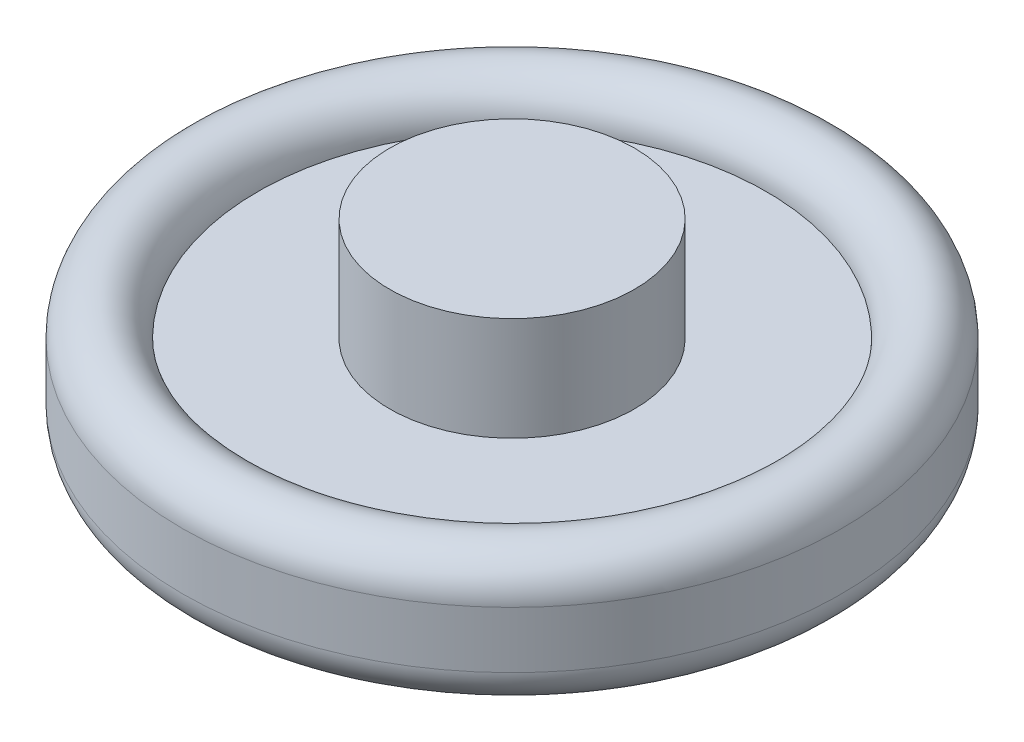
ISO-10303-21;
HEADER;
FILE_DESCRIPTION(('STEP AP214'),'2;1');
FILE_NAME('part.step','',(''),(''),'','','');
FILE_SCHEMA(('AUTOMOTIVE_DESIGN { 1 0 10303 214 1 1 1 1 }'));
ENDSEC;
DATA;
#1=APPLICATION_CONTEXT('core data for automotive mechanical design processes');
#2=APPLICATION_PROTOCOL_DEFINITION('international standard','automotive_design',2000,#1);
#3=PRODUCT_CONTEXT('',#1,'mechanical');
#4=PRODUCT('Part','Part','',(#3));
#5=PRODUCT_RELATED_PRODUCT_CATEGORY('part','',(#4));
#6=PRODUCT_DEFINITION_FORMATION('','',#4);
#7=PRODUCT_DEFINITION_CONTEXT('part definition',#1,'design');
#8=PRODUCT_DEFINITION('design','',#6,#7);
#9=PRODUCT_DEFINITION_SHAPE('','',#8);
#10=(LENGTH_UNIT() NAMED_UNIT(*) SI_UNIT(.MILLI.,.METRE.));
#11=(NAMED_UNIT(*) PLANE_ANGLE_UNIT() SI_UNIT($,.RADIAN.));
#12=(NAMED_UNIT(*) SI_UNIT($,.STERADIAN.) SOLID_ANGLE_UNIT());
#13=UNCERTAINTY_MEASURE_WITH_UNIT(LENGTH_MEASURE(1.E-05),#10,'distance_accuracy_value','');
#14=(GEOMETRIC_REPRESENTATION_CONTEXT(3) GLOBAL_UNCERTAINTY_ASSIGNED_CONTEXT((#13)) GLOBAL_UNIT_ASSIGNED_CONTEXT((#10,
#11,#12)) REPRESENTATION_CONTEXT('',''));
#15=CARTESIAN_POINT('',(0.,0.,0.));
#16=DIRECTION('',(0.,0.,1.));
#17=DIRECTION('',(1.,0.,0.));
#18=AXIS2_PLACEMENT_3D('',#15,#16,#17);
#19=CARTESIAN_POINT('',(-4.61880215351701,-0.249999999999999,0.));
#20=DIRECTION('',(0.866025403784439,0.,0.499999999999999));
#21=DIRECTION('',(0.5,0.,-0.866025403784438));
#22=AXIS2_PLACEMENT_3D('',#19,#20,#21);
#23=PLANE('',#22);
#24=DIRECTION('',(0.5,0.,-0.866025403784438));
#25=VECTOR('',#24,1.);
#26=CARTESIAN_POINT('',(-4.61880215351701,1.25,0.));
#27=LINE('',#26,#25);
#28=CARTESIAN_POINT('',(-4.61880215351701,1.25,0.));
#29=VERTEX_POINT('',#28);
#30=CARTESIAN_POINT('',(-2.3094010767585,1.25,-4.));
#31=VERTEX_POINT('',#30);
#32=EDGE_CURVE('E260',#29,#31,#27,.T.);
#33=ORIENTED_EDGE('',*,*,#32,.F.);
#34=DIRECTION('',(0.,0.999999999999998,0.));
#35=VECTOR('',#34,1.);
#36=CARTESIAN_POINT('',(-4.61880215351701,-0.249999999999999,0.));
#37=LINE('',#36,#35);
#38=CARTESIAN_POINT('',(-4.61880215351701,-0.249999999999999,0.));
#39=VERTEX_POINT('',#38);
#40=EDGE_CURVE('E240',#39,#29,#37,.T.);
#41=ORIENTED_EDGE('',*,*,#40,.F.);
#42=DIRECTION('',(0.5,0.,-0.866025403784438));
#43=VECTOR('',#42,1.);
#44=CARTESIAN_POINT('',(-4.61880215351701,-0.249999999999999,0.));
#45=LINE('',#44,#43);
#46=CARTESIAN_POINT('',(-2.3094010767585,-0.249999999999999,-4.));
#47=VERTEX_POINT('',#46);
#48=EDGE_CURVE('E247',#39,#47,#45,.T.);
#49=ORIENTED_EDGE('',*,*,#48,.T.);
#50=DIRECTION('',(0.,0.999999999999998,0.));
#51=VECTOR('',#50,1.);
#52=CARTESIAN_POINT('',(-2.3094010767585,-0.249999999999999,-4.));
#53=LINE('',#52,#51);
#54=EDGE_CURVE('E130',#47,#31,#53,.T.);
#55=ORIENTED_EDGE('',*,*,#54,.T.);
#56=EDGE_LOOP('',(#33,#41,#49,#55));
#57=FACE_BOUND('',#56,.T.);
#58=ADVANCED_FACE('F36',(#57),#23,.T.);
#59=CARTESIAN_POINT('',(-2.3094010767585,-0.249999999999999,-4.));
#60=DIRECTION('',(0.,0.,0.999999999999999));
#61=DIRECTION('',(1.,0.,0.));
#62=AXIS2_PLACEMENT_3D('',#59,#60,#61);
#63=PLANE('',#62);
#64=DIRECTION('',(1.,0.,0.));
#65=VECTOR('',#64,1.);
#66=CARTESIAN_POINT('',(-2.3094010767585,1.25,-4.));
#67=LINE('',#66,#65);
#68=CARTESIAN_POINT('',(2.30940107675851,1.25,-4.));
#69=VERTEX_POINT('',#68);
#70=EDGE_CURVE('E257',#31,#69,#67,.T.);
#71=ORIENTED_EDGE('',*,*,#70,.F.);
#72=ORIENTED_EDGE('',*,*,#54,.F.);
#73=DIRECTION('',(1.,0.,0.));
#74=VECTOR('',#73,1.);
#75=CARTESIAN_POINT('',(-2.3094010767585,-0.249999999999999,-4.));
#76=LINE('',#75,#74);
#77=CARTESIAN_POINT('',(2.30940107675851,-0.249999999999999,-3.99999999999999));
#78=VERTEX_POINT('',#77);
#79=EDGE_CURVE('E275',#47,#78,#76,.T.);
#80=ORIENTED_EDGE('',*,*,#79,.T.);
#81=DIRECTION('',(0.,0.999999999999998,0.));
#82=VECTOR('',#81,1.);
#83=CARTESIAN_POINT('',(2.30940107675851,-0.249999999999999,-3.99999999999999));
#84=LINE('',#83,#82);
#85=EDGE_CURVE('E228',#78,#69,#84,.T.);
#86=ORIENTED_EDGE('',*,*,#85,.T.);
#87=EDGE_LOOP('',(#71,#72,#80,#86));
#88=FACE_BOUND('',#87,.T.);
#89=ADVANCED_FACE('F177',(#88),#63,.T.);
#90=CARTESIAN_POINT('',(2.30940107675851,-0.249999999999999,-3.99999999999999));
#91=DIRECTION('',(-0.866025403784439,0.,0.5));
#92=DIRECTION('',(0.5,0.,0.866025403784437));
#93=AXIS2_PLACEMENT_3D('',#90,#91,#92);
#94=PLANE('',#93);
#95=DIRECTION('',(0.5,0.,0.866025403784437));
#96=VECTOR('',#95,1.);
#97=CARTESIAN_POINT('',(2.30940107675851,1.25,-4.));
#98=LINE('',#97,#96);
#99=CARTESIAN_POINT('',(4.61880215351701,1.25,0.));
#100=VERTEX_POINT('',#99);
#101=EDGE_CURVE('E254',#69,#100,#98,.T.);
#102=ORIENTED_EDGE('',*,*,#101,.F.);
#103=ORIENTED_EDGE('',*,*,#85,.F.);
#104=DIRECTION('',(0.5,0.,0.866025403784437));
#105=VECTOR('',#104,1.);
#106=CARTESIAN_POINT('',(2.30940107675851,-0.249999999999999,-3.99999999999999));
#107=LINE('',#106,#105);
#108=CARTESIAN_POINT('',(4.61880215351701,-0.249999999999999,0.));
#109=VERTEX_POINT('',#108);
#110=EDGE_CURVE('E272',#78,#109,#107,.T.);
#111=ORIENTED_EDGE('',*,*,#110,.T.);
#112=DIRECTION('',(0.,0.999999999999998,0.));
#113=VECTOR('',#112,1.);
#114=CARTESIAN_POINT('',(4.61880215351701,-0.249999999999999,0.));
#115=LINE('',#114,#113);
#116=EDGE_CURVE('E231',#109,#100,#115,.T.);
#117=ORIENTED_EDGE('',*,*,#116,.T.);
#118=EDGE_LOOP('',(#102,#103,#111,#117));
#119=FACE_BOUND('',#118,.T.);
#120=ADVANCED_FACE('F183',(#119),#94,.T.);
#121=CARTESIAN_POINT('',(4.61880215351701,-0.249999999999999,0.));
#122=DIRECTION('',(-0.866025403784439,0.,-0.499999999999999));
#123=DIRECTION('',(-0.500000000000001,0.,0.866025403784438));
#124=AXIS2_PLACEMENT_3D('',#121,#122,#123);
#125=PLANE('',#124);
#126=DIRECTION('',(-0.500000000000001,0.,0.866025403784438));
#127=VECTOR('',#126,1.);
#128=CARTESIAN_POINT('',(4.61880215351701,1.25,0.));
#129=LINE('',#128,#127);
#130=CARTESIAN_POINT('',(2.3094010767585,1.25,4.));
#131=VERTEX_POINT('',#130);
#132=EDGE_CURVE('E251',#100,#131,#129,.T.);
#133=ORIENTED_EDGE('',*,*,#132,.F.);
#134=ORIENTED_EDGE('',*,*,#116,.F.);
#135=DIRECTION('',(-0.500000000000001,0.,0.866025403784438));
#136=VECTOR('',#135,1.);
#137=CARTESIAN_POINT('',(4.61880215351701,-0.249999999999999,0.));
#138=LINE('',#137,#136);
#139=CARTESIAN_POINT('',(2.3094010767585,-0.249999999999999,4.));
#140=VERTEX_POINT('',#139);
#141=EDGE_CURVE('E269',#109,#140,#138,.T.);
#142=ORIENTED_EDGE('',*,*,#141,.T.);
#143=DIRECTION('',(0.,0.999999999999998,0.));
#144=VECTOR('',#143,1.);
#145=CARTESIAN_POINT('',(2.3094010767585,-0.249999999999999,4.));
#146=LINE('',#145,#144);
#147=EDGE_CURVE('E234',#140,#131,#146,.T.);
#148=ORIENTED_EDGE('',*,*,#147,.T.);
#149=EDGE_LOOP('',(#133,#134,#142,#148));
#150=FACE_BOUND('',#149,.T.);
#151=ADVANCED_FACE('F337',(#150),#125,.T.);
#152=CARTESIAN_POINT('',(2.3094010767585,-0.249999999999999,4.));
#153=DIRECTION('',(0.,0.,-0.999999999999999));
#154=DIRECTION('',(-1.,0.,0.));
#155=AXIS2_PLACEMENT_3D('',#152,#153,#154);
#156=PLANE('',#155);
#157=DIRECTION('',(-1.,0.,0.));
#158=VECTOR('',#157,1.);
#159=CARTESIAN_POINT('',(2.3094010767585,1.25,4.));
#160=LINE('',#159,#158);
#161=CARTESIAN_POINT('',(-2.3094010767585,1.25,4.));
#162=VERTEX_POINT('',#161);
#163=EDGE_CURVE('E248',#131,#162,#160,.T.);
#164=ORIENTED_EDGE('',*,*,#163,.F.);
#165=ORIENTED_EDGE('',*,*,#147,.F.);
#166=DIRECTION('',(-1.,0.,0.));
#167=VECTOR('',#166,1.);
#168=CARTESIAN_POINT('',(2.3094010767585,-0.249999999999999,4.));
#169=LINE('',#168,#167);
#170=CARTESIAN_POINT('',(-2.3094010767585,-0.249999999999999,4.));
#171=VERTEX_POINT('',#170);
#172=EDGE_CURVE('E266',#140,#171,#169,.T.);
#173=ORIENTED_EDGE('',*,*,#172,.T.);
#174=DIRECTION('',(0.,0.999999999999998,0.));
#175=VECTOR('',#174,1.);
#176=CARTESIAN_POINT('',(-2.3094010767585,-0.249999999999999,4.));
#177=LINE('',#176,#175);
#178=EDGE_CURVE('E237',#171,#162,#177,.T.);
#179=ORIENTED_EDGE('',*,*,#178,.T.);
#180=EDGE_LOOP('',(#164,#165,#173,#179));
#181=FACE_BOUND('',#180,.T.);
#182=ADVANCED_FACE('F339',(#181),#156,.T.);
#183=CARTESIAN_POINT('',(-2.3094010767585,-0.249999999999999,4.));
#184=DIRECTION('',(0.866025403784439,0.,-0.5));
#185=DIRECTION('',(-0.5,0.,-0.866025403784437));
#186=AXIS2_PLACEMENT_3D('',#183,#184,#185);
#187=PLANE('',#186);
#188=DIRECTION('',(-0.5,0.,-0.866025403784437));
#189=VECTOR('',#188,1.);
#190=CARTESIAN_POINT('',(-2.3094010767585,1.25,4.));
#191=LINE('',#190,#189);
#192=EDGE_CURVE('E244',#162,#29,#191,.T.);
#193=ORIENTED_EDGE('',*,*,#192,.F.);
#194=ORIENTED_EDGE('',*,*,#178,.F.);
#195=DIRECTION('',(-0.5,0.,-0.866025403784437));
#196=VECTOR('',#195,1.);
#197=CARTESIAN_POINT('',(-2.3094010767585,-0.249999999999999,4.));
#198=LINE('',#197,#196);
#199=EDGE_CURVE('E243',#171,#39,#198,.T.);
#200=ORIENTED_EDGE('',*,*,#199,.T.);
#201=ORIENTED_EDGE('',*,*,#40,.T.);
#202=EDGE_LOOP('',(#193,#194,#200,#201));
#203=FACE_BOUND('',#202,.T.);
#204=ADVANCED_FACE('F342',(#203),#187,.T.);
#205=CARTESIAN_POINT('',(0.,-0.249999999999999,0.));
#206=DIRECTION('',(0.,-0.999999999999998,0.));
#207=DIRECTION('',(0.,0.,-0.999999999999999));
#208=AXIS2_PLACEMENT_3D('',#205,#206,#207);
#209=PLANE('',#208);
#210=CARTESIAN_POINT('',(0.,-0.25,0.));
#211=DIRECTION('',(0.,-0.999999999999998,0.));
#212=DIRECTION('',(0.,0.,-0.999999999999999));
#213=AXIS2_PLACEMENT_3D('',#210,#211,#212);
#214=CIRCLE('',#213,3.);
#215=CARTESIAN_POINT('',(0.,-0.249999999999999,-3.));
#216=VERTEX_POINT('',#215);
#217=EDGE_CURVE('E282',#216,#216,#214,.T.);
#218=ORIENTED_EDGE('',*,*,#217,.T.);
#219=EDGE_LOOP('',(#218));
#220=FACE_BOUND('',#219,.T.);
#221=ORIENTED_EDGE('',*,*,#48,.F.);
#222=ORIENTED_EDGE('',*,*,#199,.F.);
#223=ORIENTED_EDGE('',*,*,#172,.F.);
#224=ORIENTED_EDGE('',*,*,#141,.F.);
#225=ORIENTED_EDGE('',*,*,#110,.F.);
#226=ORIENTED_EDGE('',*,*,#79,.F.);
#227=EDGE_LOOP('',(#221,#222,#223,#224,#225,#226));
#228=FACE_BOUND('',#227,.T.);
#229=ADVANCED_FACE('F296',(#220,#228),#209,.F.);
#230=CARTESIAN_POINT('',(0.,1.25,0.));
#231=DIRECTION('',(0.,-0.999999999999998,0.));
#232=DIRECTION('',(0.,0.,-0.999999999999999));
#233=AXIS2_PLACEMENT_3D('',#230,#231,#232);
#234=PLANE('',#233);
#235=CARTESIAN_POINT('',(0.,1.25,0.));
#236=DIRECTION('',(0.,-0.999999999999998,0.));
#237=DIRECTION('',(0.,0.,-0.999999999999999));
#238=AXIS2_PLACEMENT_3D('',#235,#236,#237);
#239=CIRCLE('',#238,3.);
#240=CARTESIAN_POINT('',(0.,1.25,-3.));
#241=VERTEX_POINT('',#240);
#242=EDGE_CURVE('E40',#241,#241,#239,.T.);
#243=ORIENTED_EDGE('',*,*,#242,.F.);
#244=EDGE_LOOP('',(#243));
#245=FACE_BOUND('',#244,.T.);
#246=ORIENTED_EDGE('',*,*,#32,.T.);
#247=ORIENTED_EDGE('',*,*,#70,.T.);
#248=ORIENTED_EDGE('',*,*,#101,.T.);
#249=ORIENTED_EDGE('',*,*,#132,.T.);
#250=ORIENTED_EDGE('',*,*,#163,.T.);
#251=ORIENTED_EDGE('',*,*,#192,.T.);
#252=EDGE_LOOP('',(#246,#247,#248,#249,#250,#251));
#253=FACE_BOUND('',#252,.T.);
#254=ADVANCED_FACE('F293',(#245,#253),#234,.T.);
#255=CARTESIAN_POINT('',(0.,13.2352813742385,0.));
#256=DIRECTION('',(0.,-0.999999999999998,0.));
#257=DIRECTION('',(0.,0.,-0.999999999999999));
#258=AXIS2_PLACEMENT_3D('',#255,#256,#257);
#259=CYLINDRICAL_SURFACE('',#258,3.);
#260=CARTESIAN_POINT('',(0.,3.24999999999999,0.));
#261=DIRECTION('',(0.,-0.999999999999998,0.));
#262=DIRECTION('',(0.,0.,-0.999999999999999));
#263=AXIS2_PLACEMENT_3D('',#260,#261,#262);
#264=CIRCLE('',#263,3.);
#265=CARTESIAN_POINT('',(0.,3.24999999999999,-3.));
#266=VERTEX_POINT('',#265);
#267=EDGE_CURVE('E263',#266,#266,#264,.T.);
#268=CARTESIAN_POINT('',(0.,1.25,-3.));
#269=CARTESIAN_POINT('',(0.,1.27083333333333,-3.));
#270=CARTESIAN_POINT('',(0.,1.29166666666667,-3.));
#271=CARTESIAN_POINT('',(0.,1.33333333333333,-3.));
#272=CARTESIAN_POINT('',(0.,1.35416666666667,-3.));
#273=CARTESIAN_POINT('',(0.,1.39583333333333,-3.));
#274=CARTESIAN_POINT('',(0.,1.41666666666667,-3.));
#275=CARTESIAN_POINT('',(0.,1.45833333333333,-3.));
#276=CARTESIAN_POINT('',(0.,1.47916666666667,-3.));
#277=CARTESIAN_POINT('',(0.,1.52083333333333,-3.));
#278=CARTESIAN_POINT('',(0.,1.54166666666667,-3.));
#279=CARTESIAN_POINT('',(0.,1.58333333333333,-3.));
#280=CARTESIAN_POINT('',(0.,1.60416666666667,-3.));
#281=CARTESIAN_POINT('',(0.,1.64583333333333,-3.));
#282=CARTESIAN_POINT('',(0.,1.66666666666667,-3.));
#283=CARTESIAN_POINT('',(0.,1.70833333333333,-3.));
#284=CARTESIAN_POINT('',(0.,1.72916666666667,-3.));
#285=CARTESIAN_POINT('',(0.,1.77083333333333,-3.));
#286=CARTESIAN_POINT('',(0.,1.79166666666666,-3.));
#287=CARTESIAN_POINT('',(0.,1.83333333333333,-3.));
#288=CARTESIAN_POINT('',(0.,1.85416666666666,-3.));
#289=CARTESIAN_POINT('',(0.,1.89583333333333,-3.));
#290=CARTESIAN_POINT('',(0.,1.91666666666666,-3.));
#291=CARTESIAN_POINT('',(0.,1.95833333333333,-3.));
#292=CARTESIAN_POINT('',(0.,1.97916666666666,-3.));
#293=CARTESIAN_POINT('',(0.,2.02083333333333,-3.));
#294=CARTESIAN_POINT('',(0.,2.04166666666666,-3.));
#295=CARTESIAN_POINT('',(0.,2.08333333333333,-3.));
#296=CARTESIAN_POINT('',(0.,2.10416666666666,-3.));
#297=CARTESIAN_POINT('',(0.,2.14583333333333,-3.));
#298=CARTESIAN_POINT('',(0.,2.16666666666666,-3.));
#299=CARTESIAN_POINT('',(0.,2.20833333333333,-3.));
#300=CARTESIAN_POINT('',(0.,2.22916666666666,-3.));
#301=CARTESIAN_POINT('',(0.,2.27083333333333,-3.));
#302=CARTESIAN_POINT('',(0.,2.29166666666666,-3.));
#303=CARTESIAN_POINT('',(0.,2.33333333333333,-3.));
#304=CARTESIAN_POINT('',(0.,2.35416666666666,-3.));
#305=CARTESIAN_POINT('',(0.,2.39583333333333,-3.));
#306=CARTESIAN_POINT('',(0.,2.41666666666666,-3.));
#307=CARTESIAN_POINT('',(0.,2.45833333333333,-3.));
#308=CARTESIAN_POINT('',(0.,2.47916666666666,-3.));
#309=CARTESIAN_POINT('',(0.,2.52083333333333,-3.));
#310=CARTESIAN_POINT('',(0.,2.54166666666666,-3.));
#311=CARTESIAN_POINT('',(0.,2.58333333333333,-3.));
#312=CARTESIAN_POINT('',(0.,2.60416666666666,-3.));
#313=CARTESIAN_POINT('',(0.,2.64583333333333,-3.));
#314=CARTESIAN_POINT('',(0.,2.66666666666666,-3.));
#315=CARTESIAN_POINT('',(0.,2.70833333333333,-3.));
#316=CARTESIAN_POINT('',(0.,2.72916666666666,-3.));
#317=CARTESIAN_POINT('',(0.,2.77083333333333,-3.));
#318=CARTESIAN_POINT('',(0.,2.79166666666666,-3.));
#319=CARTESIAN_POINT('',(0.,2.83333333333333,-3.));
#320=CARTESIAN_POINT('',(0.,2.85416666666666,-3.));
#321=CARTESIAN_POINT('',(0.,2.89583333333333,-3.));
#322=CARTESIAN_POINT('',(0.,2.91666666666666,-3.));
#323=CARTESIAN_POINT('',(0.,2.95833333333333,-3.));
#324=CARTESIAN_POINT('',(0.,2.97916666666666,-3.));
#325=CARTESIAN_POINT('',(0.,3.02083333333333,-3.));
#326=CARTESIAN_POINT('',(0.,3.04166666666666,-3.));
#327=CARTESIAN_POINT('',(0.,3.08333333333333,-3.));
#328=CARTESIAN_POINT('',(0.,3.10416666666666,-3.));
#329=CARTESIAN_POINT('',(0.,3.14583333333333,-3.));
#330=CARTESIAN_POINT('',(0.,3.16666666666666,-3.));
#331=CARTESIAN_POINT('',(0.,3.20833333333333,-3.));
#332=CARTESIAN_POINT('',(0.,3.22916666666666,-3.));
#333=CARTESIAN_POINT('',(0.,3.24999999999999,-3.));
#334=B_SPLINE_CURVE_WITH_KNOTS('',3,(#268,#269,#270,#271,#272,#273,#274,#275,#276,#277,#278,
#279,#280,#281,#282,#283,#284,#285,#286,#287,#288,#289,#290,#291,#292,#293,#294,#295,#296,#297,
#298,#299,#300,#301,#302,#303,#304,#305,#306,#307,#308,#309,#310,#311,#312,#313,#314,#315,#316,
#317,#318,#319,#320,#321,#322,#323,#324,#325,#326,#327,#328,#329,#330,#331,#332,#333),
.UNSPECIFIED.,.F.,.F.,(4,2,2,2,2,2,2,2,2,2,2,2,2,2,2,2,2,2,2,2,2,2,2,2,2,2,2,2,2,2,2,2,4),(0.,
0.0625000000000001,0.125,0.1875,0.25,0.3125,0.375,0.4375,0.499999999999999,0.562499999999997,
0.624999999999997,0.687499999999997,0.749999999999997,0.812499999999997,0.874999999999997,
0.937499999999997,0.999999999999997,1.0625,1.125,1.1875,1.25,1.3125,1.375,1.43749999999999,
1.49999999999999,1.56249999999999,1.62499999999999,1.68749999999999,1.74999999999999,
1.81249999999999,1.87499999999999,1.93749999999999,1.99999999999999),.UNSPECIFIED.);
#335=EDGE_CURVE('BSEAM216',#241,#266,#334,.T.);
#336=ORIENTED_EDGE('',*,*,#242,.T.);
#337=ORIENTED_EDGE('',*,*,#267,.F.);
#338=ORIENTED_EDGE('',*,*,#335,.T.);
#339=ORIENTED_EDGE('',*,*,#335,.F.);
#340=EDGE_LOOP('',(#336,#338,#337,#339));
#341=FACE_BOUND('',#340,.T.);
#342=ADVANCED_FACE('F216',(#341),#259,.F.);
#343=CARTESIAN_POINT('',(0.,-1.5,0.));
#344=DIRECTION('',(0.,-0.999999999999998,0.));
#345=DIRECTION('',(0.,0.,-0.999999999999999));
#346=AXIS2_PLACEMENT_3D('',#343,#344,#345);
#347=CIRCLE('',#346,3.);
#348=CARTESIAN_POINT('',(0.,-1.5,-3.));
#349=VERTEX_POINT('',#348);
#350=EDGE_CURVE('E285',#349,#349,#347,.T.);
#351=CARTESIAN_POINT('',(0.,-1.5,-3.));
#352=CARTESIAN_POINT('',(0.,-1.48697916666666,-3.));
#353=CARTESIAN_POINT('',(0.,-1.47395833333333,-3.));
#354=CARTESIAN_POINT('',(0.,-1.44791666666666,-3.));
#355=CARTESIAN_POINT('',(0.,-1.43489583333333,-3.));
#356=CARTESIAN_POINT('',(0.,-1.40885416666666,-3.));
#357=CARTESIAN_POINT('',(0.,-1.39583333333333,-3.));
#358=CARTESIAN_POINT('',(0.,-1.36979166666666,-3.));
#359=CARTESIAN_POINT('',(0.,-1.35677083333333,-3.));
#360=CARTESIAN_POINT('',(0.,-1.33072916666666,-3.));
#361=CARTESIAN_POINT('',(0.,-1.31770833333333,-3.));
#362=CARTESIAN_POINT('',(0.,-1.29166666666666,-3.));
#363=CARTESIAN_POINT('',(0.,-1.27864583333333,-3.));
#364=CARTESIAN_POINT('',(0.,-1.25260416666666,-3.));
#365=CARTESIAN_POINT('',(0.,-1.23958333333333,-3.));
#366=CARTESIAN_POINT('',(0.,-1.21354166666666,-3.));
#367=CARTESIAN_POINT('',(0.,-1.20052083333333,-3.));
#368=CARTESIAN_POINT('',(0.,-1.17447916666666,-3.));
#369=CARTESIAN_POINT('',(0.,-1.16145833333333,-3.));
#370=CARTESIAN_POINT('',(0.,-1.13541666666666,-3.));
#371=CARTESIAN_POINT('',(0.,-1.12239583333333,-3.));
#372=CARTESIAN_POINT('',(0.,-1.09635416666666,-3.));
#373=CARTESIAN_POINT('',(0.,-1.08333333333333,-3.));
#374=CARTESIAN_POINT('',(0.,-1.05729166666666,-3.));
#375=CARTESIAN_POINT('',(0.,-1.04427083333333,-3.));
#376=CARTESIAN_POINT('',(0.,-1.01822916666666,-3.));
#377=CARTESIAN_POINT('',(0.,-1.00520833333333,-3.));
#378=CARTESIAN_POINT('',(0.,-0.979166666666666,-3.));
#379=CARTESIAN_POINT('',(0.,-0.966145833333333,-3.));
#380=CARTESIAN_POINT('',(0.,-0.940104166666666,-3.));
#381=CARTESIAN_POINT('',(0.,-0.927083333333332,-3.));
#382=CARTESIAN_POINT('',(0.,-0.901041666666665,-3.));
#383=CARTESIAN_POINT('',(0.,-0.888020833333332,-3.));
#384=CARTESIAN_POINT('',(0.,-0.861979166666666,-3.));
#385=CARTESIAN_POINT('',(0.,-0.848958333333333,-3.));
#386=CARTESIAN_POINT('',(0.,-0.822916666666666,-3.));
#387=CARTESIAN_POINT('',(0.,-0.809895833333333,-3.));
#388=CARTESIAN_POINT('',(0.,-0.783854166666665,-3.));
#389=CARTESIAN_POINT('',(0.,-0.770833333333332,-3.));
#390=CARTESIAN_POINT('',(0.,-0.744791666666665,-3.));
#391=CARTESIAN_POINT('',(0.,-0.731770833333332,-3.));
#392=CARTESIAN_POINT('',(0.,-0.705729166666666,-3.));
#393=CARTESIAN_POINT('',(0.,-0.692708333333333,-3.));
#394=CARTESIAN_POINT('',(0.,-0.666666666666666,-3.));
#395=CARTESIAN_POINT('',(0.,-0.653645833333332,-3.));
#396=CARTESIAN_POINT('',(0.,-0.627604166666665,-3.));
#397=CARTESIAN_POINT('',(0.,-0.614583333333332,-3.));
#398=CARTESIAN_POINT('',(0.,-0.588541666666665,-3.));
#399=CARTESIAN_POINT('',(0.,-0.575520833333332,-3.));
#400=CARTESIAN_POINT('',(0.,-0.549479166666666,-3.));
#401=CARTESIAN_POINT('',(0.,-0.536458333333333,-3.));
#402=CARTESIAN_POINT('',(0.,-0.510416666666666,-3.));
#403=CARTESIAN_POINT('',(0.,-0.497395833333332,-3.));
#404=CARTESIAN_POINT('',(0.,-0.471354166666665,-3.));
#405=CARTESIAN_POINT('',(0.,-0.458333333333331,-3.));
#406=CARTESIAN_POINT('',(0.,-0.432291666666665,-3.));
#407=CARTESIAN_POINT('',(0.,-0.419270833333332,-3.));
#408=CARTESIAN_POINT('',(0.,-0.393229166666666,-3.));
#409=CARTESIAN_POINT('',(0.,-0.380208333333332,-3.));
#410=CARTESIAN_POINT('',(0.,-0.354166666666666,-3.));
#411=CARTESIAN_POINT('',(0.,-0.341145833333332,-3.));
#412=CARTESIAN_POINT('',(0.,-0.315104166666665,-3.));
#413=CARTESIAN_POINT('',(0.,-0.302083333333331,-3.));
#414=CARTESIAN_POINT('',(0.,-0.276041666666665,-3.));
#415=CARTESIAN_POINT('',(0.,-0.263020833333332,-3.));
#416=CARTESIAN_POINT('',(0.,-0.249999999999999,-3.));
#417=B_SPLINE_CURVE_WITH_KNOTS('',3,(#351,#352,#353,#354,#355,#356,#357,#358,#359,#360,#361,
#362,#363,#364,#365,#366,#367,#368,#369,#370,#371,#372,#373,#374,#375,#376,#377,#378,#379,#380,
#381,#382,#383,#384,#385,#386,#387,#388,#389,#390,#391,#392,#393,#394,#395,#396,#397,#398,#399,
#400,#401,#402,#403,#404,#405,#406,#407,#408,#409,#410,#411,#412,#413,#414,#415,#416),
.UNSPECIFIED.,.F.,.F.,(4,2,2,2,2,2,2,2,2,2,2,2,2,2,2,2,2,2,2,2,2,2,2,2,2,2,2,2,2,2,2,2,4),(0.,
0.0390624999999992,0.0781250000000001,0.117187500000001,0.15625,0.195312499999999,0.234375,
0.273437500000001,0.3125,0.351562499999999,0.390625,0.429687500000001,0.46875,0.507812499999998,
0.546874999999999,0.5859375,0.624999999999999,0.664062499999998,0.703124999999999,0.7421875,
0.781249999999999,0.820312499999998,0.859374999999999,0.8984375,0.937499999999999,
0.976562499999998,1.015625,1.0546875,1.09375,1.1328125,1.171875,1.2109375,1.25),.UNSPECIFIED.);
#418=EDGE_CURVE('BSEAM211',#349,#216,#417,.T.);
#419=ORIENTED_EDGE('',*,*,#350,.T.);
#420=ORIENTED_EDGE('',*,*,#217,.F.);
#421=ORIENTED_EDGE('',*,*,#418,.T.);
#422=ORIENTED_EDGE('',*,*,#418,.F.);
#423=EDGE_LOOP('',(#419,#421,#420,#422));
#424=FACE_BOUND('',#423,.T.);
#425=ADVANCED_FACE('F211',(#424),#259,.F.);
#426=CARTESIAN_POINT('',(-4.61880215351701,3.24999999999999,0.));
#427=DIRECTION('',(0.866025403784439,0.,0.499999999999999));
#428=DIRECTION('',(0.5,0.,-0.866025403784438));
#429=AXIS2_PLACEMENT_3D('',#426,#427,#428);
#430=PLANE('',#429);
#431=DIRECTION('',(0.5,0.,-0.866025403784438));
#432=VECTOR('',#431,1.);
#433=CARTESIAN_POINT('',(-4.61880215351701,4.74999999999999,0.));
#434=LINE('',#433,#432);
#435=CARTESIAN_POINT('',(-4.61880215351701,4.74999999999999,0.));
#436=VERTEX_POINT('',#435);
#437=CARTESIAN_POINT('',(-2.3094010767585,4.74999999999999,-4.));
#438=VERTEX_POINT('',#437);
#439=EDGE_CURVE('E127',#436,#438,#434,.T.);
#440=ORIENTED_EDGE('',*,*,#439,.F.);
#441=DIRECTION('',(0.,0.999999999999998,0.));
#442=VECTOR('',#441,1.);
#443=CARTESIAN_POINT('',(-4.61880215351701,3.24999999999999,0.));
#444=LINE('',#443,#442);
#445=CARTESIAN_POINT('',(-4.61880215351701,3.24999999999999,0.));
#446=VERTEX_POINT('',#445);
#447=EDGE_CURVE('E123',#446,#436,#444,.T.);
#448=ORIENTED_EDGE('',*,*,#447,.F.);
#449=DIRECTION('',(0.5,0.,-0.866025403784438));
#450=VECTOR('',#449,1.);
#451=CARTESIAN_POINT('',(-4.61880215351701,3.24999999999999,0.));
#452=LINE('',#451,#450);
#453=CARTESIAN_POINT('',(-2.3094010767585,3.24999999999999,-4.));
#454=VERTEX_POINT('',#453);
#455=EDGE_CURVE('E138',#446,#454,#452,.T.);
#456=ORIENTED_EDGE('',*,*,#455,.T.);
#457=DIRECTION('',(0.,0.999999999999998,0.));
#458=VECTOR('',#457,1.);
#459=CARTESIAN_POINT('',(-2.3094010767585,3.24999999999999,-4.));
#460=LINE('',#459,#458);
#461=EDGE_CURVE('E145',#454,#438,#460,.T.);
#462=ORIENTED_EDGE('',*,*,#461,.T.);
#463=EDGE_LOOP('',(#440,#448,#456,#462));
#464=FACE_BOUND('',#463,.T.);
#465=ADVANCED_FACE('F208',(#464),#430,.T.);
#466=CARTESIAN_POINT('',(-2.3094010767585,3.24999999999999,-4.));
#467=DIRECTION('',(0.,0.,0.999999999999999));
#468=DIRECTION('',(1.,0.,0.));
#469=AXIS2_PLACEMENT_3D('',#466,#467,#468);
#470=PLANE('',#469);
#471=DIRECTION('',(1.,0.,0.));
#472=VECTOR('',#471,1.);
#473=CARTESIAN_POINT('',(-2.3094010767585,4.74999999999999,-4.));
#474=LINE('',#473,#472);
#475=CARTESIAN_POINT('',(2.3094010767585,4.74999999999999,-3.99999999999999));
#476=VERTEX_POINT('',#475);
#477=EDGE_CURVE('E129',#438,#476,#474,.T.);
#478=ORIENTED_EDGE('',*,*,#477,.F.);
#479=ORIENTED_EDGE('',*,*,#461,.F.);
#480=DIRECTION('',(1.,0.,0.));
#481=VECTOR('',#480,1.);
#482=CARTESIAN_POINT('',(-2.3094010767585,3.24999999999999,-4.));
#483=LINE('',#482,#481);
#484=CARTESIAN_POINT('',(2.30940107675851,3.24999999999999,-4.));
#485=VERTEX_POINT('',#484);
#486=EDGE_CURVE('E92',#454,#485,#483,.T.);
#487=ORIENTED_EDGE('',*,*,#486,.T.);
#488=DIRECTION('',(0.,0.999999999999998,0.));
#489=VECTOR('',#488,1.);
#490=CARTESIAN_POINT('',(2.30940107675851,3.24999999999999,-4.));
#491=LINE('',#490,#489);
#492=EDGE_CURVE('E142',#485,#476,#491,.T.);
#493=ORIENTED_EDGE('',*,*,#492,.T.);
#494=EDGE_LOOP('',(#478,#479,#487,#493));
#495=FACE_BOUND('',#494,.T.);
#496=ADVANCED_FACE('F205',(#495),#470,.T.);
#497=CARTESIAN_POINT('',(2.30940107675851,3.24999999999999,-4.));
#498=DIRECTION('',(-0.866025403784439,0.,0.5));
#499=DIRECTION('',(0.5,0.,0.866025403784437));
#500=AXIS2_PLACEMENT_3D('',#497,#498,#499);
#501=PLANE('',#500);
#502=DIRECTION('',(0.5,0.,0.866025403784437));
#503=VECTOR('',#502,1.);
#504=CARTESIAN_POINT('',(2.3094010767585,4.74999999999999,-3.99999999999999));
#505=LINE('',#504,#503);
#506=CARTESIAN_POINT('',(4.61880215351701,4.74999999999999,0.));
#507=VERTEX_POINT('',#506);
#508=EDGE_CURVE('E132',#476,#507,#505,.T.);
#509=ORIENTED_EDGE('',*,*,#508,.F.);
#510=ORIENTED_EDGE('',*,*,#492,.F.);
#511=DIRECTION('',(0.5,0.,0.866025403784437));
#512=VECTOR('',#511,1.);
#513=CARTESIAN_POINT('',(2.30940107675851,3.24999999999999,-4.));
#514=LINE('',#513,#512);
#515=CARTESIAN_POINT('',(4.61880215351701,3.24999999999999,0.));
#516=VERTEX_POINT('',#515);
#517=EDGE_CURVE('E115',#485,#516,#514,.T.);
#518=ORIENTED_EDGE('',*,*,#517,.T.);
#519=DIRECTION('',(0.,0.999999999999998,0.));
#520=VECTOR('',#519,1.);
#521=CARTESIAN_POINT('',(4.61880215351701,3.24999999999999,0.));
#522=LINE('',#521,#520);
#523=EDGE_CURVE('E112',#516,#507,#522,.T.);
#524=ORIENTED_EDGE('',*,*,#523,.T.);
#525=EDGE_LOOP('',(#509,#510,#518,#524));
#526=FACE_BOUND('',#525,.T.);
#527=ADVANCED_FACE('F202',(#526),#501,.T.);
#528=CARTESIAN_POINT('',(4.61880215351701,3.24999999999999,0.));
#529=DIRECTION('',(-0.866025403784439,0.,-0.499999999999999));
#530=DIRECTION('',(-0.500000000000001,0.,0.866025403784438));
#531=AXIS2_PLACEMENT_3D('',#528,#529,#530);
#532=PLANE('',#531);
#533=DIRECTION('',(-0.500000000000001,0.,0.866025403784438));
#534=VECTOR('',#533,1.);
#535=CARTESIAN_POINT('',(4.61880215351701,4.74999999999999,0.));
#536=LINE('',#535,#534);
#537=CARTESIAN_POINT('',(2.3094010767585,4.74999999999999,4.));
#538=VERTEX_POINT('',#537);
#539=EDGE_CURVE('E134',#507,#538,#536,.T.);
#540=ORIENTED_EDGE('',*,*,#539,.F.);
#541=ORIENTED_EDGE('',*,*,#523,.F.);
#542=DIRECTION('',(-0.500000000000001,0.,0.866025403784438));
#543=VECTOR('',#542,1.);
#544=CARTESIAN_POINT('',(4.61880215351701,3.24999999999999,0.));
#545=LINE('',#544,#543);
#546=CARTESIAN_POINT('',(2.3094010767585,3.24999999999999,4.));
#547=VERTEX_POINT('',#546);
#548=EDGE_CURVE('E106',#516,#547,#545,.T.);
#549=ORIENTED_EDGE('',*,*,#548,.T.);
#550=DIRECTION('',(0.,0.999999999999998,0.));
#551=VECTOR('',#550,1.);
#552=CARTESIAN_POINT('',(2.3094010767585,3.24999999999999,4.));
#553=LINE('',#552,#551);
#554=EDGE_CURVE('E110',#547,#538,#553,.T.);
#555=ORIENTED_EDGE('',*,*,#554,.T.);
#556=EDGE_LOOP('',(#540,#541,#549,#555));
#557=FACE_BOUND('',#556,.T.);
#558=ADVANCED_FACE('F109',(#557),#532,.T.);
#559=CARTESIAN_POINT('',(2.3094010767585,3.24999999999999,4.));
#560=DIRECTION('',(0.,0.,-0.999999999999999));
#561=DIRECTION('',(-1.,0.,0.));
#562=AXIS2_PLACEMENT_3D('',#559,#560,#561);
#563=PLANE('',#562);
#564=DIRECTION('',(-1.,0.,0.));
#565=VECTOR('',#564,1.);
#566=CARTESIAN_POINT('',(2.3094010767585,4.74999999999999,4.));
#567=LINE('',#566,#565);
#568=CARTESIAN_POINT('',(-2.30940107675851,4.74999999999999,4.));
#569=VERTEX_POINT('',#568);
#570=EDGE_CURVE('E79',#538,#569,#567,.T.);
#571=ORIENTED_EDGE('',*,*,#570,.F.);
#572=ORIENTED_EDGE('',*,*,#554,.F.);
#573=DIRECTION('',(-1.,0.,0.));
#574=VECTOR('',#573,1.);
#575=CARTESIAN_POINT('',(2.3094010767585,3.24999999999999,4.));
#576=LINE('',#575,#574);
#577=CARTESIAN_POINT('',(-2.3094010767585,3.24999999999999,4.));
#578=VERTEX_POINT('',#577);
#579=EDGE_CURVE('E114',#547,#578,#576,.T.);
#580=ORIENTED_EDGE('',*,*,#579,.T.);
#581=DIRECTION('',(0.,0.999999999999998,0.));
#582=VECTOR('',#581,1.);
#583=CARTESIAN_POINT('',(-2.3094010767585,3.24999999999999,4.));
#584=LINE('',#583,#582);
#585=EDGE_CURVE('E119',#578,#569,#584,.T.);
#586=ORIENTED_EDGE('',*,*,#585,.T.);
#587=EDGE_LOOP('',(#571,#572,#580,#586));
#588=FACE_BOUND('',#587,.T.);
#589=ADVANCED_FACE('F118',(#588),#563,.T.);
#590=CARTESIAN_POINT('',(-2.3094010767585,3.24999999999999,4.));
#591=DIRECTION('',(0.866025403784439,0.,-0.5));
#592=DIRECTION('',(-0.5,0.,-0.866025403784437));
#593=AXIS2_PLACEMENT_3D('',#590,#591,#592);
#594=PLANE('',#593);
#595=DIRECTION('',(-0.5,0.,-0.866025403784437));
#596=VECTOR('',#595,1.);
#597=CARTESIAN_POINT('',(-2.30940107675851,4.74999999999999,4.));
#598=LINE('',#597,#596);
#599=EDGE_CURVE('E84',#569,#436,#598,.T.);
#600=ORIENTED_EDGE('',*,*,#599,.F.);
#601=ORIENTED_EDGE('',*,*,#585,.F.);
#602=DIRECTION('',(-0.5,0.,-0.866025403784437));
#603=VECTOR('',#602,1.);
#604=CARTESIAN_POINT('',(-2.3094010767585,3.24999999999999,4.));
#605=LINE('',#604,#603);
#606=EDGE_CURVE('E55',#578,#446,#605,.T.);
#607=ORIENTED_EDGE('',*,*,#606,.T.);
#608=ORIENTED_EDGE('',*,*,#447,.T.);
#609=EDGE_LOOP('',(#600,#601,#607,#608));
#610=FACE_BOUND('',#609,.T.);
#611=ADVANCED_FACE('F192',(#610),#594,.T.);
#612=CARTESIAN_POINT('',(0.,3.24999999999999,0.));
#613=DIRECTION('',(0.,-0.999999999999998,0.));
#614=DIRECTION('',(0.,0.,-0.999999999999999));
#615=AXIS2_PLACEMENT_3D('',#612,#613,#614);
#616=PLANE('',#615);
#617=ORIENTED_EDGE('',*,*,#267,.T.);
#618=EDGE_LOOP('',(#617));
#619=FACE_BOUND('',#618,.T.);
#620=ORIENTED_EDGE('',*,*,#455,.F.);
#621=ORIENTED_EDGE('',*,*,#606,.F.);
#622=ORIENTED_EDGE('',*,*,#579,.F.);
#623=ORIENTED_EDGE('',*,*,#548,.F.);
#624=ORIENTED_EDGE('',*,*,#517,.F.);
#625=ORIENTED_EDGE('',*,*,#486,.F.);
#626=EDGE_LOOP('',(#620,#621,#622,#623,#624,#625));
#627=FACE_BOUND('',#626,.T.);
#628=ADVANCED_FACE('F121',(#619,#627),#616,.F.);
#629=CARTESIAN_POINT('',(0.,4.74999999999999,0.));
#630=DIRECTION('',(0.,-0.999999999999998,0.));
#631=DIRECTION('',(0.,0.,-0.999999999999999));
#632=AXIS2_PLACEMENT_3D('',#629,#630,#631);
#633=PLANE('',#632);
#634=ORIENTED_EDGE('',*,*,#439,.T.);
#635=ORIENTED_EDGE('',*,*,#477,.T.);
#636=ORIENTED_EDGE('',*,*,#508,.T.);
#637=ORIENTED_EDGE('',*,*,#539,.T.);
#638=ORIENTED_EDGE('',*,*,#570,.T.);
#639=ORIENTED_EDGE('',*,*,#599,.T.);
#640=EDGE_LOOP('',(#634,#635,#636,#637,#638,#639));
#641=FACE_BOUND('',#640,.T.);
#642=ADVANCED_FACE('F191',(#641),#633,.T.);
#643=CARTESIAN_POINT('',(0.,1.5,0.));
#644=DIRECTION('',(0.,0.999999999999998,0.));
#645=DIRECTION('',(0.,0.,0.999999999999999));
#646=AXIS2_PLACEMENT_3D('',#643,#644,#645);
#647=PLANE('',#646);
#648=CARTESIAN_POINT('',(0.,1.5,0.));
#649=DIRECTION('',(0.,0.999999999999998,0.));
#650=DIRECTION('',(0.,0.,0.999999999999999));
#651=AXIS2_PLACEMENT_3D('',#648,#649,#650);
#652=CIRCLE('',#651,13.5);
#653=CARTESIAN_POINT('',(0.,1.5,13.5));
#654=VERTEX_POINT('',#653);
#655=EDGE_CURVE('E46',#654,#654,#652,.T.);
#656=ORIENTED_EDGE('',*,*,#655,.T.);
#657=EDGE_LOOP('',(#656));
#658=FACE_BOUND('',#657,.T.);
#659=CARTESIAN_POINT('',(0.,1.5,0.));
#660=DIRECTION('',(0.,0.999999999999998,0.));
#661=DIRECTION('',(0.,0.,0.999999999999999));
#662=AXIS2_PLACEMENT_3D('',#659,#660,#661);
#663=CIRCLE('',#662,6.5);
#664=CARTESIAN_POINT('',(0.,1.5,-6.49999999999999));
#665=VERTEX_POINT('',#664);
#666=EDGE_CURVE('E151',#665,#665,#663,.F.);
#667=ORIENTED_EDGE('',*,*,#666,.T.);
#668=EDGE_LOOP('',(#667));
#669=FACE_BOUND('',#668,.T.);
#670=ADVANCED_FACE('F162',(#658,#669),#647,.T.);
#671=CARTESIAN_POINT('',(0.,0.,0.));
#672=DIRECTION('',(0.,0.999999999999998,0.));
#673=DIRECTION('',(0.,0.,0.999999999999999));
#674=AXIS2_PLACEMENT_3D('',#671,#672,#673);
#675=CYLINDRICAL_SURFACE('',#674,17.5);
#676=CARTESIAN_POINT('',(0.,1.5,0.));
#677=DIRECTION('',(0.,0.999999999999998,0.));
#678=DIRECTION('',(0.,0.,0.999999999999999));
#679=AXIS2_PLACEMENT_3D('',#676,#677,#678);
#680=CIRCLE('',#679,17.5);
#681=CARTESIAN_POINT('',(0.,1.5,17.5));
#682=VERTEX_POINT('',#681);
#683=EDGE_CURVE('E11',#682,#682,#680,.T.);
#684=CARTESIAN_POINT('',(0.,-1.5,0.));
#685=DIRECTION('',(0.,0.999999999999998,0.));
#686=DIRECTION('',(0.,0.,0.999999999999999));
#687=AXIS2_PLACEMENT_3D('',#684,#685,#686);
#688=CIRCLE('',#687,17.5);
#689=CARTESIAN_POINT('',(0.,-1.5,17.5));
#690=VERTEX_POINT('',#689);
#691=EDGE_CURVE('E152',#690,#690,#688,.T.);
#692=CARTESIAN_POINT('',(0.,1.5,17.5));
#693=CARTESIAN_POINT('',(0.,1.46875,17.5));
#694=CARTESIAN_POINT('',(0.,1.4375,17.5));
#695=CARTESIAN_POINT('',(0.,1.375,17.5));
#696=CARTESIAN_POINT('',(0.,1.34375,17.5));
#697=CARTESIAN_POINT('',(0.,1.28125,17.5));
#698=CARTESIAN_POINT('',(0.,1.25,17.5));
#699=CARTESIAN_POINT('',(0.,1.1875,17.5));
#700=CARTESIAN_POINT('',(0.,1.15625,17.5));
#701=CARTESIAN_POINT('',(0.,1.09375,17.5));
#702=CARTESIAN_POINT('',(0.,1.0625,17.5));
#703=CARTESIAN_POINT('',(0.,0.999999999999997,17.5));
#704=CARTESIAN_POINT('',(0.,0.968749999999997,17.5));
#705=CARTESIAN_POINT('',(0.,0.906249999999998,17.5));
#706=CARTESIAN_POINT('',(0.,0.874999999999998,17.5));
#707=CARTESIAN_POINT('',(0.,0.812499999999998,17.5));
#708=CARTESIAN_POINT('',(0.,0.781249999999998,17.5));
#709=CARTESIAN_POINT('',(0.,0.718749999999998,17.5));
#710=CARTESIAN_POINT('',(0.,0.687499999999998,17.5));
#711=CARTESIAN_POINT('',(0.,0.624999999999998,17.5));
#712=CARTESIAN_POINT('',(0.,0.593749999999998,17.5));
#713=CARTESIAN_POINT('',(0.,0.531249999999999,17.5));
#714=CARTESIAN_POINT('',(0.,0.499999999999999,17.5));
#715=CARTESIAN_POINT('',(0.,0.437499999999999,17.5));
#716=CARTESIAN_POINT('',(0.,0.406249999999999,17.5));
#717=CARTESIAN_POINT('',(0.,0.343749999999999,17.5));
#718=CARTESIAN_POINT('',(0.,0.312499999999999,17.5));
#719=CARTESIAN_POINT('',(0.,0.249999999999999,17.5));
#720=CARTESIAN_POINT('',(0.,0.218749999999999,17.5));
#721=CARTESIAN_POINT('',(0.,0.156249999999999,17.5));
#722=CARTESIAN_POINT('',(0.,0.124999999999999,17.5));
#723=CARTESIAN_POINT('',(0.,0.0624999999999996,17.5));
#724=CARTESIAN_POINT('',(0.,0.0312499999999997,17.5));
#725=CARTESIAN_POINT('',(0.,-0.0312500000000001,17.5));
#726=CARTESIAN_POINT('',(0.,-0.0625,17.5));
#727=CARTESIAN_POINT('',(0.,-0.125,17.5));
#728=CARTESIAN_POINT('',(0.,-0.15625,17.5));
#729=CARTESIAN_POINT('',(0.,-0.21875,17.5));
#730=CARTESIAN_POINT('',(0.,-0.25,17.5));
#731=CARTESIAN_POINT('',(0.,-0.312499999999999,17.5));
#732=CARTESIAN_POINT('',(0.,-0.343749999999999,17.5));
#733=CARTESIAN_POINT('',(0.,-0.406249999999999,17.5));
#734=CARTESIAN_POINT('',(0.,-0.437499999999999,17.5));
#735=CARTESIAN_POINT('',(0.,-0.499999999999999,17.5));
#736=CARTESIAN_POINT('',(0.,-0.531249999999999,17.5));
#737=CARTESIAN_POINT('',(0.,-0.593749999999999,17.5));
#738=CARTESIAN_POINT('',(0.,-0.624999999999999,17.5));
#739=CARTESIAN_POINT('',(0.,-0.687499999999999,17.5));
#740=CARTESIAN_POINT('',(0.,-0.718749999999998,17.5));
#741=CARTESIAN_POINT('',(0.,-0.781249999999998,17.5));
#742=CARTESIAN_POINT('',(0.,-0.812499999999998,17.5));
#743=CARTESIAN_POINT('',(0.,-0.874999999999998,17.5));
#744=CARTESIAN_POINT('',(0.,-0.906249999999998,17.5));
#745=CARTESIAN_POINT('',(0.,-0.968749999999998,17.5));
#746=CARTESIAN_POINT('',(0.,-0.999999999999998,17.5));
#747=CARTESIAN_POINT('',(0.,-1.0625,17.5));
#748=CARTESIAN_POINT('',(0.,-1.09375,17.5));
#749=CARTESIAN_POINT('',(0.,-1.15625,17.5));
#750=CARTESIAN_POINT('',(0.,-1.1875,17.5));
#751=CARTESIAN_POINT('',(0.,-1.25,17.5));
#752=CARTESIAN_POINT('',(0.,-1.28125,17.5));
#753=CARTESIAN_POINT('',(0.,-1.34375,17.5));
#754=CARTESIAN_POINT('',(0.,-1.375,17.5));
#755=CARTESIAN_POINT('',(0.,-1.4375,17.5));
#756=CARTESIAN_POINT('',(0.,-1.46875,17.5));
#757=CARTESIAN_POINT('',(0.,-1.5,17.5));
#758=B_SPLINE_CURVE_WITH_KNOTS('',3,(#692,#693,#694,#695,#696,#697,#698,#699,#700,#701,#702,
#703,#704,#705,#706,#707,#708,#709,#710,#711,#712,#713,#714,#715,#716,#717,#718,#719,#720,#721,
#722,#723,#724,#725,#726,#727,#728,#729,#730,#731,#732,#733,#734,#735,#736,#737,#738,#739,#740,
#741,#742,#743,#744,#745,#746,#747,#748,#749,#750,#751,#752,#753,#754,#755,#756,#757),
.UNSPECIFIED.,.F.,.F.,(4,2,2,2,2,2,2,2,2,2,2,2,2,2,2,2,2,2,2,2,2,2,2,2,2,2,2,2,2,2,2,2,4),(0.,
0.0937499999999999,0.1875,0.281249999999999,0.374999999999999,0.468749999999999,
0.562499999999999,0.656249999999998,0.749999999999998,0.843749999999998,0.937499999999998,
1.03125,1.125,1.21875,1.3125,1.40625,1.5,1.59375,1.6875,1.78125,1.87499999999999,
1.96874999999999,2.06249999999999,2.15624999999999,2.24999999999999,2.34374999999999,
2.43749999999999,2.53124999999999,2.62499999999999,2.71874999999999,2.81249999999999,
2.90624999999999,2.99999999999999),.UNSPECIFIED.);
#759=EDGE_CURVE('BSEAM453',#682,#690,#758,.T.);
#760=ORIENTED_EDGE('',*,*,#683,.F.);
#761=ORIENTED_EDGE('',*,*,#691,.T.);
#762=ORIENTED_EDGE('',*,*,#759,.T.);
#763=ORIENTED_EDGE('',*,*,#759,.F.);
#764=EDGE_LOOP('',(#760,#762,#761,#763));
#765=FACE_BOUND('',#764,.T.);
#766=ADVANCED_FACE('F453',(#765),#675,.T.);
#767=CARTESIAN_POINT('',(0.,-1.5,0.));
#768=DIRECTION('',(0.,0.999999999999998,0.));
#769=DIRECTION('',(0.,0.,0.999999999999999));
#770=AXIS2_PLACEMENT_3D('',#767,#768,#769);
#771=TOROIDAL_SURFACE('',#770,15.5,2.);
#772=ORIENTED_EDGE('',*,*,#691,.F.);
#773=EDGE_LOOP('',(#772));
#774=FACE_BOUND('',#773,.T.);
#775=CARTESIAN_POINT('',(0.,-1.5,0.));
#776=DIRECTION('',(0.,0.999999999999998,0.));
#777=DIRECTION('',(0.,0.,0.999999999999999));
#778=AXIS2_PLACEMENT_3D('',#775,#776,#777);
#779=CIRCLE('',#778,13.5);
#780=CARTESIAN_POINT('',(0.,-1.5,13.5));
#781=VERTEX_POINT('',#780);
#782=EDGE_CURVE('E155',#781,#781,#779,.T.);
#783=ORIENTED_EDGE('',*,*,#782,.T.);
#784=EDGE_LOOP('',(#783));
#785=FACE_BOUND('',#784,.T.);
#786=ADVANCED_FACE('F464',(#774,#785),#771,.T.);
#787=CARTESIAN_POINT('',(0.,1.5,0.));
#788=DIRECTION('',(0.,0.999999999999998,0.));
#789=DIRECTION('',(0.,0.,0.999999999999999));
#790=AXIS2_PLACEMENT_3D('',#787,#788,#789);
#791=TOROIDAL_SURFACE('',#790,15.5,2.);
#792=ORIENTED_EDGE('',*,*,#655,.F.);
#793=EDGE_LOOP('',(#792));
#794=FACE_BOUND('',#793,.T.);
#795=ORIENTED_EDGE('',*,*,#683,.T.);
#796=EDGE_LOOP('',(#795));
#797=FACE_BOUND('',#796,.T.);
#798=ADVANCED_FACE('F474',(#794,#797),#791,.T.);
#799=CARTESIAN_POINT('',(0.,-1.5,0.));
#800=DIRECTION('',(0.,0.999999999999998,0.));
#801=DIRECTION('',(0.,0.,0.999999999999999));
#802=AXIS2_PLACEMENT_3D('',#799,#800,#801);
#803=PLANE('',#802);
#804=ORIENTED_EDGE('',*,*,#350,.F.);
#805=EDGE_LOOP('',(#804));
#806=FACE_BOUND('',#805,.T.);
#807=ORIENTED_EDGE('',*,*,#782,.F.);
#808=EDGE_LOOP('',(#807));
#809=FACE_BOUND('',#808,.T.);
#810=ADVANCED_FACE('F38',(#806,#809),#803,.F.);
#811=CARTESIAN_POINT('',(0.,6.99999999999999,0.));
#812=DIRECTION('',(0.,-0.999999999999998,0.));
#813=DIRECTION('',(0.,0.,-0.999999999999999));
#814=AXIS2_PLACEMENT_3D('',#811,#812,#813);
#815=CYLINDRICAL_SURFACE('',#814,6.5);
#816=CARTESIAN_POINT('',(0.,6.99999999999999,0.));
#817=DIRECTION('',(0.,0.999999999999998,0.));
#818=DIRECTION('',(0.,0.,0.999999999999999));
#819=AXIS2_PLACEMENT_3D('',#816,#817,#818);
#820=CIRCLE('',#819,6.5);
#821=CARTESIAN_POINT('',(0.,6.99999999999999,-6.49999999999999));
#822=VERTEX_POINT('',#821);
#823=EDGE_CURVE('E148',#822,#822,#820,.T.);
#824=CARTESIAN_POINT('',(0.,1.5,-6.49999999999999));
#825=CARTESIAN_POINT('',(0.,1.55729166666666,-6.49999999999999));
#826=CARTESIAN_POINT('',(0.,1.61458333333333,-6.49999999999999));
#827=CARTESIAN_POINT('',(0.,1.72916666666666,-6.49999999999999));
#828=CARTESIAN_POINT('',(0.,1.78645833333333,-6.49999999999999));
#829=CARTESIAN_POINT('',(0.,1.90104166666666,-6.49999999999999));
#830=CARTESIAN_POINT('',(0.,1.95833333333333,-6.49999999999999));
#831=CARTESIAN_POINT('',(0.,2.07291666666666,-6.49999999999999));
#832=CARTESIAN_POINT('',(0.,2.13020833333333,-6.49999999999999));
#833=CARTESIAN_POINT('',(0.,2.24479166666666,-6.49999999999999));
#834=CARTESIAN_POINT('',(0.,2.30208333333333,-6.49999999999999));
#835=CARTESIAN_POINT('',(0.,2.41666666666666,-6.49999999999999));
#836=CARTESIAN_POINT('',(0.,2.47395833333333,-6.49999999999999));
#837=CARTESIAN_POINT('',(0.,2.58854166666666,-6.49999999999999));
#838=CARTESIAN_POINT('',(0.,2.64583333333333,-6.49999999999999));
#839=CARTESIAN_POINT('',(0.,2.76041666666666,-6.49999999999999));
#840=CARTESIAN_POINT('',(0.,2.81770833333333,-6.49999999999999));
#841=CARTESIAN_POINT('',(0.,2.93229166666666,-6.49999999999999));
#842=CARTESIAN_POINT('',(0.,2.98958333333333,-6.49999999999999));
#843=CARTESIAN_POINT('',(0.,3.10416666666666,-6.49999999999999));
#844=CARTESIAN_POINT('',(0.,3.16145833333333,-6.49999999999999));
#845=CARTESIAN_POINT('',(0.,3.27604166666666,-6.49999999999999));
#846=CARTESIAN_POINT('',(0.,3.33333333333333,-6.49999999999999));
#847=CARTESIAN_POINT('',(0.,3.44791666666666,-6.49999999999999));
#848=CARTESIAN_POINT('',(0.,3.50520833333333,-6.49999999999999));
#849=CARTESIAN_POINT('',(0.,3.61979166666666,-6.49999999999999));
#850=CARTESIAN_POINT('',(0.,3.67708333333333,-6.49999999999999));
#851=CARTESIAN_POINT('',(0.,3.79166666666666,-6.49999999999999));
#852=CARTESIAN_POINT('',(0.,3.84895833333333,-6.49999999999999));
#853=CARTESIAN_POINT('',(0.,3.96354166666666,-6.49999999999999));
#854=CARTESIAN_POINT('',(0.,4.02083333333333,-6.49999999999999));
#855=CARTESIAN_POINT('',(0.,4.13541666666666,-6.49999999999999));
#856=CARTESIAN_POINT('',(0.,4.19270833333333,-6.49999999999999));
#857=CARTESIAN_POINT('',(0.,4.30729166666666,-6.49999999999999));
#858=CARTESIAN_POINT('',(0.,4.36458333333333,-6.49999999999999));
#859=CARTESIAN_POINT('',(0.,4.47916666666666,-6.49999999999999));
#860=CARTESIAN_POINT('',(0.,4.53645833333333,-6.49999999999999));
#861=CARTESIAN_POINT('',(0.,4.65104166666666,-6.49999999999999));
#862=CARTESIAN_POINT('',(0.,4.70833333333333,-6.49999999999999));
#863=CARTESIAN_POINT('',(0.,4.82291666666666,-6.49999999999999));
#864=CARTESIAN_POINT('',(0.,4.88020833333332,-6.49999999999999));
#865=CARTESIAN_POINT('',(0.,4.99479166666666,-6.49999999999999));
#866=CARTESIAN_POINT('',(0.,5.05208333333332,-6.49999999999999));
#867=CARTESIAN_POINT('',(0.,5.16666666666666,-6.49999999999999));
#868=CARTESIAN_POINT('',(0.,5.22395833333332,-6.49999999999999));
#869=CARTESIAN_POINT('',(0.,5.33854166666666,-6.49999999999999));
#870=CARTESIAN_POINT('',(0.,5.39583333333332,-6.49999999999999));
#871=CARTESIAN_POINT('',(0.,5.51041666666666,-6.49999999999999));
#872=CARTESIAN_POINT('',(0.,5.56770833333332,-6.49999999999999));
#873=CARTESIAN_POINT('',(0.,5.68229166666666,-6.49999999999999));
#874=CARTESIAN_POINT('',(0.,5.73958333333332,-6.49999999999999));
#875=CARTESIAN_POINT('',(0.,5.85416666666666,-6.49999999999999));
#876=CARTESIAN_POINT('',(0.,5.91145833333332,-6.49999999999999));
#877=CARTESIAN_POINT('',(0.,6.02604166666666,-6.49999999999999));
#878=CARTESIAN_POINT('',(0.,6.08333333333332,-6.49999999999999));
#879=CARTESIAN_POINT('',(0.,6.19791666666666,-6.49999999999999));
#880=CARTESIAN_POINT('',(0.,6.25520833333332,-6.49999999999999));
#881=CARTESIAN_POINT('',(0.,6.36979166666665,-6.49999999999999));
#882=CARTESIAN_POINT('',(0.,6.42708333333332,-6.49999999999999));
#883=CARTESIAN_POINT('',(0.,6.54166666666665,-6.49999999999999));
#884=CARTESIAN_POINT('',(0.,6.59895833333332,-6.49999999999999));
#885=CARTESIAN_POINT('',(0.,6.71354166666665,-6.49999999999999));
#886=CARTESIAN_POINT('',(0.,6.77083333333332,-6.49999999999999));
#887=CARTESIAN_POINT('',(0.,6.88541666666665,-6.49999999999999));
#888=CARTESIAN_POINT('',(0.,6.94270833333332,-6.49999999999999));
#889=CARTESIAN_POINT('',(0.,6.99999999999999,-6.49999999999999));
#890=B_SPLINE_CURVE_WITH_KNOTS('',3,(#824,#825,#826,#827,#828,#829,#830,#831,#832,#833,#834,
#835,#836,#837,#838,#839,#840,#841,#842,#843,#844,#845,#846,#847,#848,#849,#850,#851,#852,#853,
#854,#855,#856,#857,#858,#859,#860,#861,#862,#863,#864,#865,#866,#867,#868,#869,#870,#871,#872,
#873,#874,#875,#876,#877,#878,#879,#880,#881,#882,#883,#884,#885,#886,#887,#888,#889),
.UNSPECIFIED.,.F.,.F.,(4,2,2,2,2,2,2,2,2,2,2,2,2,2,2,2,2,2,2,2,2,2,2,2,2,2,2,2,2,2,2,2,4),(0.,
0.171875,0.34375,0.515624999999999,0.687499999999999,0.859374999999999,1.03125,1.203125,1.375,
1.546875,1.71875,1.890625,2.0625,2.234375,2.40625,2.578125,2.74999999999999,2.92187499999999,
3.09374999999999,3.26562499999999,3.43749999999999,3.60937499999999,3.78124999999999,
3.95312499999999,4.12499999999999,4.29687499999999,4.46874999999999,4.64062499999999,
4.81249999999999,4.98437499999999,5.15624999999999,5.32812499999999,5.49999999999999),.UNSPECIFIED.);
#891=EDGE_CURVE('BSEAM164',#665,#822,#890,.T.);
#892=ORIENTED_EDGE('',*,*,#666,.F.);
#893=ORIENTED_EDGE('',*,*,#823,.F.);
#894=ORIENTED_EDGE('',*,*,#891,.T.);
#895=ORIENTED_EDGE('',*,*,#891,.F.);
#896=EDGE_LOOP('',(#892,#894,#893,#895));
#897=FACE_BOUND('',#896,.T.);
#898=ADVANCED_FACE('F164',(#897),#815,.T.);
#899=CARTESIAN_POINT('',(0.,6.99999999999999,0.));
#900=DIRECTION('',(0.,0.999999999999998,0.));
#901=DIRECTION('',(0.,0.,0.999999999999999));
#902=AXIS2_PLACEMENT_3D('',#899,#900,#901);
#903=PLANE('',#902);
#904=ORIENTED_EDGE('',*,*,#823,.T.);
#905=EDGE_LOOP('',(#904));
#906=FACE_BOUND('',#905,.T.);
#907=ADVANCED_FACE('F167',(#906),#903,.T.);
#908=CLOSED_SHELL('',(#58,#89,#120,#151,#182,#204,#229,#254,#342,#425,#465,#496,#527,#558,#589,
#611,#628,#642,#670,#766,#786,#798,#810,#898,#907));
#909=MANIFOLD_SOLID_BREP('B2',#908);
#910=ADVANCED_BREP_SHAPE_REPRESENTATION('',(#18,#909),#14);
#911=SHAPE_DEFINITION_REPRESENTATION(#9,#910);
ENDSEC;
END-ISO-10303-21;
